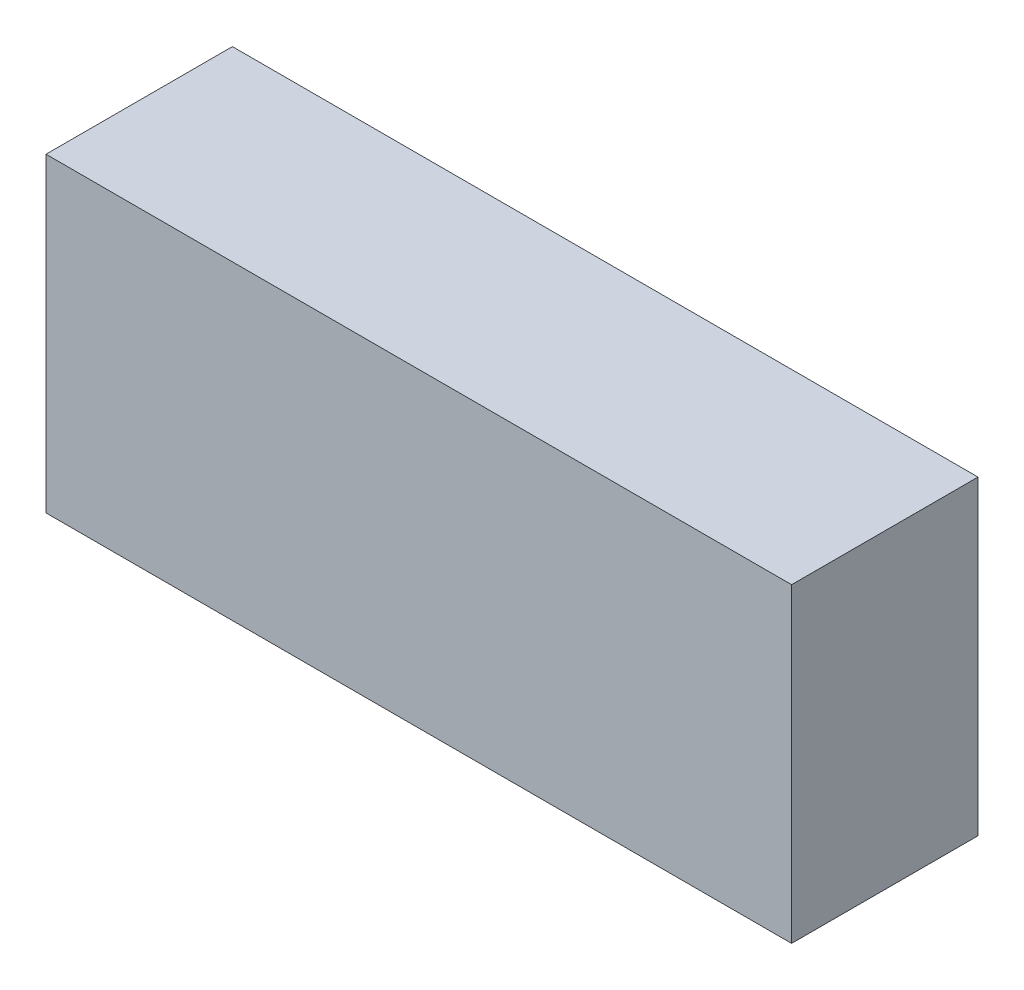
ISO-10303-21;
HEADER;
FILE_DESCRIPTION(('STEP AP214'),'2;1');
FILE_NAME('part.step','',(''),(''),'','','');
FILE_SCHEMA(('AUTOMOTIVE_DESIGN { 1 0 10303 214 1 1 1 1 }'));
ENDSEC;
DATA;
#1=APPLICATION_CONTEXT('core data for automotive mechanical design processes');
#2=APPLICATION_PROTOCOL_DEFINITION('international standard','automotive_design',2000,#1);
#3=PRODUCT_CONTEXT('',#1,'mechanical');
#4=PRODUCT('Part','Part','',(#3));
#5=PRODUCT_RELATED_PRODUCT_CATEGORY('part','',(#4));
#6=PRODUCT_DEFINITION_FORMATION('','',#4);
#7=PRODUCT_DEFINITION_CONTEXT('part definition',#1,'design');
#8=PRODUCT_DEFINITION('design','',#6,#7);
#9=PRODUCT_DEFINITION_SHAPE('','',#8);
#10=(LENGTH_UNIT() NAMED_UNIT(*) SI_UNIT(.MILLI.,.METRE.));
#11=(NAMED_UNIT(*) PLANE_ANGLE_UNIT() SI_UNIT($,.RADIAN.));
#12=(NAMED_UNIT(*) SI_UNIT($,.STERADIAN.) SOLID_ANGLE_UNIT());
#13=UNCERTAINTY_MEASURE_WITH_UNIT(LENGTH_MEASURE(1.E-05),#10,'distance_accuracy_value','');
#14=(GEOMETRIC_REPRESENTATION_CONTEXT(3) GLOBAL_UNCERTAINTY_ASSIGNED_CONTEXT((#13)) GLOBAL_UNIT_ASSIGNED_CONTEXT((#10,
#11,#12)) REPRESENTATION_CONTEXT('',''));
#15=CARTESIAN_POINT('',(0.,0.,0.));
#16=DIRECTION('',(0.,0.,1.));
#17=DIRECTION('',(1.,0.,0.));
#18=AXIS2_PLACEMENT_3D('',#15,#16,#17);
#19=CARTESIAN_POINT('',(12.,0.,0.));
#20=DIRECTION('',(0.,0.,-1.));
#21=DIRECTION('',(-1.,0.,0.));
#22=AXIS2_PLACEMENT_3D('',#19,#20,#21);
#23=PLANE('',#22);
#24=DIRECTION('',(0.,-1.,0.));
#25=VECTOR('',#24,1.);
#26=CARTESIAN_POINT('',(0.,0.,0.));
#27=LINE('',#26,#25);
#28=CARTESIAN_POINT('',(0.,5.,0.));
#29=VERTEX_POINT('',#28);
#30=CARTESIAN_POINT('',(0.,0.,0.));
#31=VERTEX_POINT('',#30);
#32=EDGE_CURVE('E96',#29,#31,#27,.T.);
#33=ORIENTED_EDGE('',*,*,#32,.T.);
#34=DIRECTION('',(-1.,0.,0.));
#35=VECTOR('',#34,1.);
#36=CARTESIAN_POINT('',(12.,0.,0.));
#37=LINE('',#36,#35);
#38=CARTESIAN_POINT('',(12.,0.,0.));
#39=VERTEX_POINT('',#38);
#40=EDGE_CURVE('E11',#39,#31,#37,.T.);
#41=ORIENTED_EDGE('',*,*,#40,.F.);
#42=DIRECTION('',(0.,-1.,0.));
#43=VECTOR('',#42,1.);
#44=CARTESIAN_POINT('',(12.,0.,0.));
#45=LINE('',#44,#43);
#46=CARTESIAN_POINT('',(12.,5.,0.));
#47=VERTEX_POINT('',#46);
#48=EDGE_CURVE('E84',#47,#39,#45,.T.);
#49=ORIENTED_EDGE('',*,*,#48,.F.);
#50=DIRECTION('',(-1.,0.,0.));
#51=VECTOR('',#50,1.);
#52=CARTESIAN_POINT('',(12.,5.,0.));
#53=LINE('',#52,#51);
#54=EDGE_CURVE('E92',#47,#29,#53,.T.);
#55=ORIENTED_EDGE('',*,*,#54,.T.);
#56=EDGE_LOOP('',(#33,#41,#49,#55));
#57=FACE_BOUND('',#56,.T.);
#58=ADVANCED_FACE('F33',(#57),#23,.F.);
#59=CARTESIAN_POINT('',(12.,0.,0.));
#60=DIRECTION('',(0.,1.,0.));
#61=DIRECTION('',(0.,0.,1.));
#62=AXIS2_PLACEMENT_3D('',#59,#60,#61);
#63=PLANE('',#62);
#64=DIRECTION('',(0.,0.,-1.));
#65=VECTOR('',#64,1.);
#66=CARTESIAN_POINT('',(0.,0.,0.));
#67=LINE('',#66,#65);
#68=CARTESIAN_POINT('',(0.,0.,-3.));
#69=VERTEX_POINT('',#68);
#70=EDGE_CURVE('E88',#31,#69,#67,.T.);
#71=ORIENTED_EDGE('',*,*,#70,.T.);
#72=DIRECTION('',(-1.,0.,0.));
#73=VECTOR('',#72,1.);
#74=CARTESIAN_POINT('',(12.,0.,-3.));
#75=LINE('',#74,#73);
#76=CARTESIAN_POINT('',(12.,0.,-3.));
#77=VERTEX_POINT('',#76);
#78=EDGE_CURVE('E41',#77,#69,#75,.T.);
#79=ORIENTED_EDGE('',*,*,#78,.F.);
#80=DIRECTION('',(0.,0.,-1.));
#81=VECTOR('',#80,1.);
#82=CARTESIAN_POINT('',(12.,0.,0.));
#83=LINE('',#82,#81);
#84=EDGE_CURVE('E79',#39,#77,#83,.T.);
#85=ORIENTED_EDGE('',*,*,#84,.F.);
#86=ORIENTED_EDGE('',*,*,#40,.T.);
#87=EDGE_LOOP('',(#71,#79,#85,#86));
#88=FACE_BOUND('',#87,.T.);
#89=ADVANCED_FACE('F87',(#88),#63,.F.);
#90=CARTESIAN_POINT('',(12.,0.,-3.));
#91=DIRECTION('',(0.,0.,1.));
#92=DIRECTION('',(1.,0.,0.));
#93=AXIS2_PLACEMENT_3D('',#90,#91,#92);
#94=PLANE('',#93);
#95=DIRECTION('',(0.,1.,0.));
#96=VECTOR('',#95,1.);
#97=CARTESIAN_POINT('',(0.,0.,-3.));
#98=LINE('',#97,#96);
#99=CARTESIAN_POINT('',(0.,5.,-3.));
#100=VERTEX_POINT('',#99);
#101=EDGE_CURVE('E66',#69,#100,#98,.T.);
#102=ORIENTED_EDGE('',*,*,#101,.T.);
#103=DIRECTION('',(-1.,0.,0.));
#104=VECTOR('',#103,1.);
#105=CARTESIAN_POINT('',(12.,5.,-3.));
#106=LINE('',#105,#104);
#107=CARTESIAN_POINT('',(12.,5.,-3.));
#108=VERTEX_POINT('',#107);
#109=EDGE_CURVE('E89',#108,#100,#106,.T.);
#110=ORIENTED_EDGE('',*,*,#109,.F.);
#111=DIRECTION('',(0.,1.,0.));
#112=VECTOR('',#111,1.);
#113=CARTESIAN_POINT('',(12.,0.,-3.));
#114=LINE('',#113,#112);
#115=EDGE_CURVE('E82',#77,#108,#114,.T.);
#116=ORIENTED_EDGE('',*,*,#115,.F.);
#117=ORIENTED_EDGE('',*,*,#78,.T.);
#118=EDGE_LOOP('',(#102,#110,#116,#117));
#119=FACE_BOUND('',#118,.T.);
#120=ADVANCED_FACE('F90',(#119),#94,.F.);
#121=CARTESIAN_POINT('',(12.,5.,0.));
#122=DIRECTION('',(0.,-1.,0.));
#123=DIRECTION('',(0.,0.,-1.));
#124=AXIS2_PLACEMENT_3D('',#121,#122,#123);
#125=PLANE('',#124);
#126=DIRECTION('',(0.,0.,1.));
#127=VECTOR('',#126,1.);
#128=CARTESIAN_POINT('',(0.,5.,0.));
#129=LINE('',#128,#127);
#130=EDGE_CURVE('E72',#100,#29,#129,.T.);
#131=ORIENTED_EDGE('',*,*,#130,.T.);
#132=ORIENTED_EDGE('',*,*,#54,.F.);
#133=DIRECTION('',(0.,0.,1.));
#134=VECTOR('',#133,1.);
#135=CARTESIAN_POINT('',(12.,5.,0.));
#136=LINE('',#135,#134);
#137=EDGE_CURVE('E49',#108,#47,#136,.T.);
#138=ORIENTED_EDGE('',*,*,#137,.F.);
#139=ORIENTED_EDGE('',*,*,#109,.T.);
#140=EDGE_LOOP('',(#131,#132,#138,#139));
#141=FACE_BOUND('',#140,.T.);
#142=ADVANCED_FACE('F103',(#141),#125,.F.);
#143=CARTESIAN_POINT('',(12.,0.,0.));
#144=DIRECTION('',(-1.,0.,0.));
#145=DIRECTION('',(0.,0.,1.));
#146=AXIS2_PLACEMENT_3D('',#143,#144,#145);
#147=PLANE('',#146);
#148=ORIENTED_EDGE('',*,*,#48,.T.);
#149=ORIENTED_EDGE('',*,*,#84,.T.);
#150=ORIENTED_EDGE('',*,*,#115,.T.);
#151=ORIENTED_EDGE('',*,*,#137,.T.);
#152=EDGE_LOOP('',(#148,#149,#150,#151));
#153=FACE_BOUND('',#152,.T.);
#154=ADVANCED_FACE('F80',(#153),#147,.F.);
#155=CARTESIAN_POINT('',(0.,0.,0.));
#156=DIRECTION('',(-1.,0.,0.));
#157=DIRECTION('',(0.,0.,1.));
#158=AXIS2_PLACEMENT_3D('',#155,#156,#157);
#159=PLANE('',#158);
#160=ORIENTED_EDGE('',*,*,#32,.F.);
#161=ORIENTED_EDGE('',*,*,#130,.F.);
#162=ORIENTED_EDGE('',*,*,#101,.F.);
#163=ORIENTED_EDGE('',*,*,#70,.F.);
#164=EDGE_LOOP('',(#160,#161,#162,#163));
#165=FACE_BOUND('',#164,.T.);
#166=ADVANCED_FACE('F106',(#165),#159,.T.);
#167=CLOSED_SHELL('',(#58,#89,#120,#142,#154,#166));
#168=MANIFOLD_SOLID_BREP('B2',#167);
#169=ADVANCED_BREP_SHAPE_REPRESENTATION('',(#18,#168),#14);
#170=SHAPE_DEFINITION_REPRESENTATION(#9,#169);
ENDSEC;
END-ISO-10303-21;
